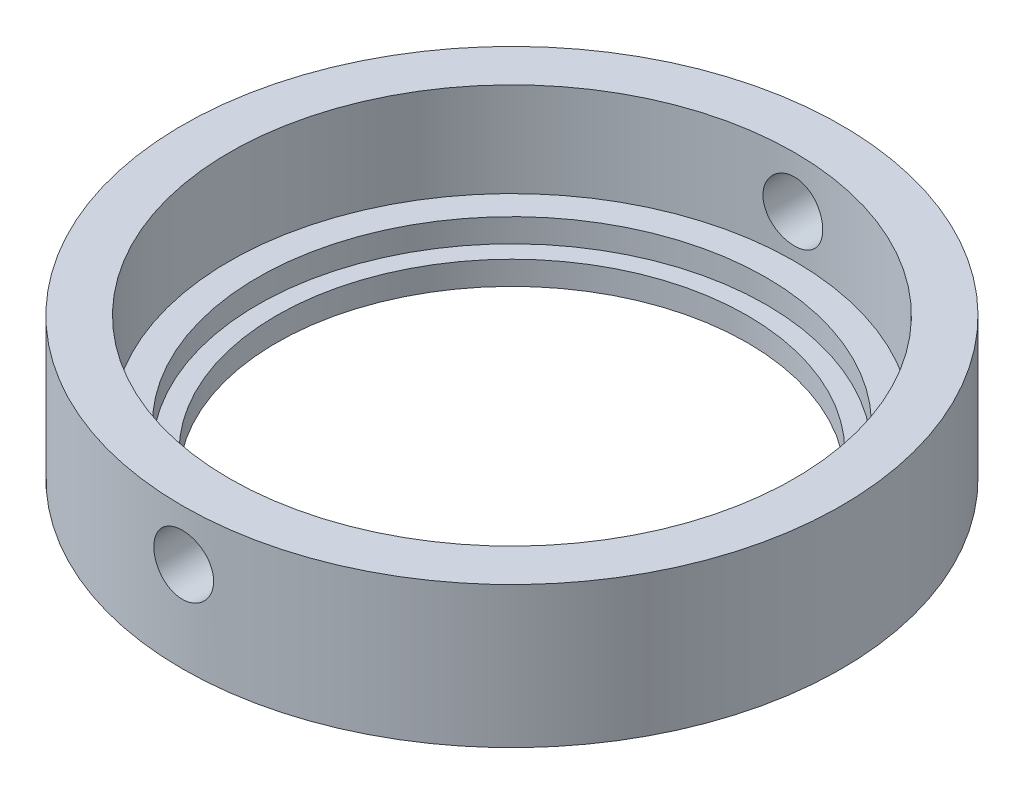
ISO-10303-21;
HEADER;
FILE_DESCRIPTION(('STEP AP214'),'2;1');
FILE_NAME('part.step','',(''),(''),'','','');
FILE_SCHEMA(('AUTOMOTIVE_DESIGN { 1 0 10303 214 1 1 1 1 }'));
ENDSEC;
DATA;
#1=APPLICATION_CONTEXT('core data for automotive mechanical design processes');
#2=APPLICATION_PROTOCOL_DEFINITION('international standard','automotive_design',2000,#1);
#3=PRODUCT_CONTEXT('',#1,'mechanical');
#4=PRODUCT('Part','Part','',(#3));
#5=PRODUCT_RELATED_PRODUCT_CATEGORY('part','',(#4));
#6=PRODUCT_DEFINITION_FORMATION('','',#4);
#7=PRODUCT_DEFINITION_CONTEXT('part definition',#1,'design');
#8=PRODUCT_DEFINITION('design','',#6,#7);
#9=PRODUCT_DEFINITION_SHAPE('','',#8);
#10=(LENGTH_UNIT() NAMED_UNIT(*) SI_UNIT(.MILLI.,.METRE.));
#11=(NAMED_UNIT(*) PLANE_ANGLE_UNIT() SI_UNIT($,.RADIAN.));
#12=(NAMED_UNIT(*) SI_UNIT($,.STERADIAN.) SOLID_ANGLE_UNIT());
#13=UNCERTAINTY_MEASURE_WITH_UNIT(LENGTH_MEASURE(1.E-05),#10,'distance_accuracy_value','');
#14=(GEOMETRIC_REPRESENTATION_CONTEXT(3) GLOBAL_UNCERTAINTY_ASSIGNED_CONTEXT((#13)) GLOBAL_UNIT_ASSIGNED_CONTEXT((#10,
#11,#12)) REPRESENTATION_CONTEXT('',''));
#15=CARTESIAN_POINT('',(0.,0.,0.));
#16=DIRECTION('',(0.,0.,1.));
#17=DIRECTION('',(1.,0.,0.));
#18=AXIS2_PLACEMENT_3D('',#15,#16,#17);
#19=CARTESIAN_POINT('',(0.,25.,0.));
#20=DIRECTION('',(0.,-1.,0.));
#21=DIRECTION('',(0.,0.,-1.));
#22=AXIS2_PLACEMENT_3D('',#19,#20,#21);
#23=CYLINDRICAL_SURFACE('',#22,35.);
#24=CARTESIAN_POINT('',(0.,12.747,-35.));
#25=CARTESIAN_POINT('',(-0.177948742697632,12.7469922545125,-34.9999981255321));
#26=CARTESIAN_POINT('',(-0.356017159290866,12.7319894593025,-34.9986284485605));
#27=CARTESIAN_POINT('',(-0.707223011450132,12.6723636020864,-34.9932962323467));
#28=CARTESIAN_POINT('',(-0.880354698570392,12.6277073710008,-34.9893307896615));
#29=CARTESIAN_POINT('',(-1.21655001135586,12.51008030149,-34.9792549516629));
#30=CARTESIAN_POINT('',(-1.37961943170621,12.4371259392296,-34.9731458046864));
#31=CARTESIAN_POINT('',(-1.69116073272575,12.2650040682958,-34.9594668246718));
#32=CARTESIAN_POINT('',(-1.83963563448663,12.1658420004081,-34.9518972949009));
#33=CARTESIAN_POINT('',(-2.11825486781866,11.9438002526063,-34.9361210135998));
#34=CARTESIAN_POINT('',(-2.24834947817906,11.8208582930058,-34.9279126233868));
#35=CARTESIAN_POINT('',(-2.48608826872777,11.5548788468456,-34.9117974222512));
#36=CARTESIAN_POINT('',(-2.59373144116536,11.4118404587239,-34.9038906248788));
#37=CARTESIAN_POINT('',(-2.78368370229865,11.109422703355,-34.8892566499268));
#38=CARTESIAN_POINT('',(-2.86594849261247,10.950015402935,-34.8825315437145));
#39=CARTESIAN_POINT('',(-3.00252588383444,10.619579058852,-34.8710419026051));
#40=CARTESIAN_POINT('',(-3.05683906092586,10.4485502548324,-34.8662773272948));
#41=CARTESIAN_POINT('',(-3.13582576722564,10.1002282230882,-34.8592624859316));
#42=CARTESIAN_POINT('',(-3.16058099809251,9.92295366417832,-34.8570052903947));
#43=CARTESIAN_POINT('',(-3.18000156835787,9.56675245101314,-34.85523906293));
#44=CARTESIAN_POINT('',(-3.17466756743406,9.38782583306353,-34.8557299707526));
#45=CARTESIAN_POINT('',(-3.13412853022921,9.03396085199345,-34.8593981713109));
#46=CARTESIAN_POINT('',(-3.099012460119,8.85901220228197,-34.8625674629733));
#47=CARTESIAN_POINT('',(-3.00004440808104,8.51750220556002,-34.8712228066297));
#48=CARTESIAN_POINT('',(-2.93619210010109,8.35094095373996,-34.8767088849107));
#49=CARTESIAN_POINT('',(-2.78146508731726,8.03065133599692,-34.8893888718863));
#50=CARTESIAN_POINT('',(-2.69055065422548,7.87694226550939,-34.8965852882732));
#51=CARTESIAN_POINT('',(-2.48430871747526,7.58693131231446,-34.9118728705317));
#52=CARTESIAN_POINT('',(-2.36898062671689,7.45062984835178,-34.9199640579186));
#53=CARTESIAN_POINT('',(-2.11668700776328,7.19878604614869,-34.9361651349145));
#54=CARTESIAN_POINT('',(-1.97964460037356,7.08332070792731,-34.9442749860746));
#55=CARTESIAN_POINT('',(-1.68808015987427,6.8770227560871,-34.959571797186));
#56=CARTESIAN_POINT('',(-1.53355811204054,6.78619016321815,-34.9667587563598));
#57=CARTESIAN_POINT('',(-1.2113692658288,6.63174018207928,-34.9794017793163));
#58=CARTESIAN_POINT('',(-1.04370072296146,6.56812641289895,-34.9848576128989));
#59=CARTESIAN_POINT('',(-0.700002269337119,6.46997481012006,-34.9934211590151));
#60=CARTESIAN_POINT('',(-0.523972564365016,6.43543626131362,-34.9965289293076));
#61=CARTESIAN_POINT('',(-0.169215792966083,6.39651254292779,-35.0000387747087));
#62=CARTESIAN_POINT('',(0.00949951840106239,6.39202105967293,-35.0004503893503));
#63=CARTESIAN_POINT('',(0.365140481966832,6.41304015925837,-34.9985470668293));
#64=CARTESIAN_POINT('',(0.542066153976297,6.43855040961989,-34.996232159882));
#65=CARTESIAN_POINT('',(0.888800869856207,6.51876068219514,-34.9891421663528));
#66=CARTESIAN_POINT('',(1.05862145445478,6.57341121574768,-34.984371251259));
#67=CARTESIAN_POINT('',(1.38668342386707,6.71030004971781,-34.9729048825346));
#68=CARTESIAN_POINT('',(1.54492459302018,6.79253886379361,-34.9662093930713));
#69=CARTESIAN_POINT('',(1.84581834398523,6.98253549147747,-34.9516199689331));
#70=CARTESIAN_POINT('',(1.98842644581429,7.09036349173276,-34.9437227599138));
#71=CARTESIAN_POINT('',(2.25355641777019,7.32837658048486,-34.9276274589351));
#72=CARTESIAN_POINT('',(2.37607787394442,7.45856212962064,-34.919429360779));
#73=CARTESIAN_POINT('',(2.59792317453891,7.73805724027525,-34.9036278187437));
#74=CARTESIAN_POINT('',(2.69717747445058,7.88742211946041,-34.8960262016566));
#75=CARTESIAN_POINT('',(2.86919363716132,8.20076168059596,-34.8823050529928));
#76=CARTESIAN_POINT('',(2.9419558060689,8.36473619370922,-34.8761855042916));
#77=CARTESIAN_POINT('',(3.05880464720211,8.70239740384427,-34.8661321652402));
#78=CARTESIAN_POINT('',(3.1029333886915,8.87606944329042,-34.8621951694497));
#79=CARTESIAN_POINT('',(3.16139949835712,9.22839533348805,-34.8569423290691));
#80=CARTESIAN_POINT('',(3.17573755679722,9.40704906871414,-34.8556264237472));
#81=CARTESIAN_POINT('',(3.17420665739822,9.76357587731869,-34.8557658194857));
#82=CARTESIAN_POINT('',(3.15844695661828,9.94144943391356,-34.8572110972571));
#83=CARTESIAN_POINT('',(3.09739625157212,10.2920117882234,-34.8626886861032));
#84=CARTESIAN_POINT('',(3.05210520683774,10.4647005788332,-34.8667210007229));
#85=CARTESIAN_POINT('',(2.93330620875594,10.799995105634,-34.8769156279369));
#86=CARTESIAN_POINT('',(2.85980076072276,10.9626017355876,-34.8830777514086));
#87=CARTESIAN_POINT('',(2.68667125180549,11.273185484489,-34.8968380429297));
#88=CARTESIAN_POINT('',(2.58704748946488,11.4211627706297,-34.9044361945643));
#89=CARTESIAN_POINT('',(2.36409852020826,11.6988469854394,-34.9202453521334));
#90=CARTESIAN_POINT('',(2.24069212754026,11.8284886156796,-34.9284583966232));
#91=CARTESIAN_POINT('',(1.97383516253548,12.0652755596085,-34.9445532724279));
#92=CARTESIAN_POINT('',(1.83037976847913,12.1724154461421,-34.9524350234731));
#93=CARTESIAN_POINT('',(1.52717127800737,12.3613295541533,-34.9669961169828));
#94=CARTESIAN_POINT('',(1.36738405595656,12.4430491580035,-34.9736728576436));
#95=CARTESIAN_POINT('',(1.03640157261243,12.578392017516,-34.985042217158));
#96=CARTESIAN_POINT('',(0.865219572025612,12.6320473103248,-34.989737097241));
#97=CARTESIAN_POINT('',(0.577537133788959,12.6961934239307,-34.995419226925));
#98=CARTESIAN_POINT('',(0.462882318395325,12.7152202701312,-34.9971291170419));
#99=CARTESIAN_POINT('',(0.232168649082416,12.7406260645485,-34.9994201132818));
#100=CARTESIAN_POINT('',(0.116109799725645,12.7470050538542,-35.0000012230718));
#101=CARTESIAN_POINT('',(0.,12.747,-35.));
#102=B_SPLINE_CURVE_WITH_KNOTS('',3,(#24,#25,#26,#27,#28,#29,#30,#31,#32,#33,#34,#35,#36,#37,
#38,#39,#40,#41,#42,#43,#44,#45,#46,#47,#48,#49,#50,#51,#52,#53,#54,#55,#56,#57,#58,#59,#60,#61,
#62,#63,#64,#65,#66,#67,#68,#69,#70,#71,#72,#73,#74,#75,#76,#77,#78,#79,#80,#81,#82,#83,#84,#85,
#86,#87,#88,#89,#90,#91,#92,#93,#94,#95,#96,#97,#98,#99,#100,#101),.UNSPECIFIED.,.T.,.F.,(4,2,2,
2,2,2,2,2,2,2,2,2,2,2,2,2,2,2,2,2,2,2,2,2,2,2,2,2,2,2,2,2,2,2,2,2,2,2,4),(0.,0.533422274666073,
1.06744222027115,1.60115170631514,2.13475047984098,2.66976615190117,3.20480583340133,
3.7407742190956,4.27673155611119,4.81120398854059,5.34566470321744,5.87853445657277,
6.41141025622195,6.94507222980037,7.47874703834623,8.01435536534802,8.54996414352853,
9.08564411561022,9.62131091036304,10.1550813813275,10.6888459371112,11.2217068794814,
11.7545777435862,12.2889274245621,12.8232881162188,13.3592261841087,13.8951580592009,
14.4303007301311,14.9654310014203,15.4986224025451,16.0318145343282,16.5649593319566,
17.0980980357781,17.6330900048623,18.1682108598915,18.7044736501385,19.2401229197564,
19.5881768242244,19.9362295979712),.UNSPECIFIED.);
#103=CARTESIAN_POINT('',(0.,12.747,-35.));
#104=VERTEX_POINT('',#103);
#105=EDGE_CURVE('E64',#104,#104,#102,.T.);
#106=ORIENTED_EDGE('',*,*,#105,.T.);
#107=EDGE_LOOP('',(#106));
#108=FACE_BOUND('',#107,.T.);
#109=CARTESIAN_POINT('',(3.175,9.572,34.8556935808198));
#110=CARTESIAN_POINT('',(3.17499225298625,9.39405295587084,34.8556954839668));
#111=CARTESIAN_POINT('',(3.1599897345043,9.21598623239612,34.8570709530369));
#112=CARTESIAN_POINT('',(3.10036507642202,8.86478389815338,34.8624238641418));
#113=CARTESIAN_POINT('',(3.05570976189453,8.6916540371603,34.8664042203977));
#114=CARTESIAN_POINT('',(2.93808537367766,8.35546258547041,34.8765124084333));
#115=CARTESIAN_POINT('',(2.86513281976534,8.19239518462475,34.8826389870582));
#116=CARTESIAN_POINT('',(2.69301520717176,7.88085726641007,34.8963477534327));
#117=CARTESIAN_POINT('',(2.59385558482639,7.73238373047528,34.9039296392075));
#118=CARTESIAN_POINT('',(2.37181630567926,7.45376295077408,34.919720384041));
#119=CARTESIAN_POINT('',(2.24887382299168,7.3236658618069,34.927930868133));
#120=CARTESIAN_POINT('',(1.98289229050827,7.08592228868483,34.9440388735663));
#121=CARTESIAN_POINT('',(1.83985234590731,6.97827680467972,34.9519363809529));
#122=CARTESIAN_POINT('',(1.53743323085979,6.78832212953939,34.9665443096334));
#123=CARTESIAN_POINT('',(1.37802639486786,6.70605681135373,34.9732526669059));
#124=CARTESIAN_POINT('',(1.04759106032629,6.56947831603079,34.9847088526285));
#125=CARTESIAN_POINT('',(0.876562798805127,6.51516456899193,34.9894567210505));
#126=CARTESIAN_POINT('',(0.52824241134786,6.43617666698811,34.996445592504));
#127=CARTESIAN_POINT('',(0.350968964567076,6.41142076213594,34.9986935086152));
#128=CARTESIAN_POINT('',(-0.00523007230355185,6.39199845859546,35.0004526620261));
#129=CARTESIAN_POINT('',(-0.184155626486546,6.39733140748658,34.9999639586642));
#130=CARTESIAN_POINT('',(-0.538025257188273,6.4378687828075,34.996310620611));
#131=CARTESIAN_POINT('',(-0.712979496513702,6.47298530196683,34.9931538608783));
#132=CARTESIAN_POINT('',(-1.05450044075038,6.57195619106736,34.9845284005082));
#133=CARTESIAN_POINT('',(-1.22106705343012,6.63581087694077,34.9790596744543));
#134=CARTESIAN_POINT('',(-1.54136315517237,6.79054280562973,34.9664117978506));
#135=CARTESIAN_POINT('',(-1.69507361877193,6.88145922065337,34.9592301708692));
#136=CARTESIAN_POINT('',(-1.98508651690573,7.08770538333184,34.943963042256));
#137=CARTESIAN_POINT('',(-2.12138853192588,7.20303571914285,34.9358775188506));
#138=CARTESIAN_POINT('',(-2.37322978425635,7.4553309258492,34.9196763524415));
#139=CARTESIAN_POINT('',(-2.48869247525424,7.59237221876483,34.9115607058394));
#140=CARTESIAN_POINT('',(-2.69498561767334,7.88393348796268,34.896243166354));
#141=CARTESIAN_POINT('',(-2.785816042904,8.03845348282908,34.8890412744422));
#142=CARTESIAN_POINT('',(-2.94026446650022,8.36064178289025,34.8763656405157));
#143=CARTESIAN_POINT('',(-3.00387817461475,8.52831215609212,34.8708921709928));
#144=CARTESIAN_POINT('',(-3.10202909393681,8.87201458668889,34.862298609853));
#145=CARTESIAN_POINT('',(-3.13656703139726,9.04804643511532,34.8591784594551));
#146=CARTESIAN_POINT('',(-3.17548844537965,9.40280418772215,34.8556546509312));
#147=CARTESIAN_POINT('',(-3.1799788110361,9.58151827314583,34.8552413637105));
#148=CARTESIAN_POINT('',(-3.15895791387345,9.93715651597856,34.8571526652915));
#149=CARTESIAN_POINT('',(-3.13344698353553,10.1140806932019,34.8594772237519));
#150=CARTESIAN_POINT('',(-3.05323690051932,10.4608080542854,34.8665935287785));
#151=CARTESIAN_POINT('',(-2.99858790737458,10.630622936216,34.8713810350229));
#152=CARTESIAN_POINT('',(-2.86170406510119,10.9586741822125,34.8828803261072));
#153=CARTESIAN_POINT('',(-2.77946869324707,11.1169103268074,34.88959214741));
#154=CARTESIAN_POINT('',(-2.58947711869073,11.4178006779816,34.9042071527232));
#155=CARTESIAN_POINT('',(-2.48164985451852,11.5604098516584,34.9121136313401));
#156=CARTESIAN_POINT('',(-2.2436376176175,11.8255423293219,34.9282161096282));
#157=CARTESIAN_POINT('',(-2.11345218942717,11.9480652240284,34.9364121151946));
#158=CARTESIAN_POINT('',(-1.833956445836,12.1699135993673,34.9521990100422));
#159=CARTESIAN_POINT('',(-1.68459079227429,12.2691695127211,34.9597880410291));
#160=CARTESIAN_POINT('',(-1.37124925537308,12.4411885069556,34.9734790184658));
#161=CARTESIAN_POINT('',(-1.20727354109164,12.5139518943409,34.9795809821201));
#162=CARTESIAN_POINT('',(-0.86961311658115,12.6308015486909,34.9896018196359));
#163=CARTESIAN_POINT('',(-0.695943247457922,12.6749304127714,34.9935239350172));
#164=CARTESIAN_POINT('',(-0.343621931785847,12.7333975031489,34.9987563838885));
#165=CARTESIAN_POINT('',(-0.164970598821014,12.7477364081347,35.0000667768799));
#166=CARTESIAN_POINT('',(0.19155768962503,12.7462079640708,34.9999281768158));
#167=CARTESIAN_POINT('',(0.369435122939479,12.7304488532393,34.9984890714753));
#168=CARTESIAN_POINT('',(0.720005377176429,12.669397963676,34.993032696508));
#169=CARTESIAN_POINT('',(0.892698192200208,12.624106151345,34.9890154239482));
#170=CARTESIAN_POINT('',(1.22800073512134,12.5053041152694,34.9788531733981));
#171=CARTESIAN_POINT('',(1.39061134625823,12.4317963674169,34.972708382098));
#172=CARTESIAN_POINT('',(1.70120209680973,12.2586610274661,34.9589774952473));
#173=CARTESIAN_POINT('',(1.84918240588149,12.1590337383065,34.9513914164132));
#174=CARTESIAN_POINT('',(2.12686640745159,11.936080905487,34.9355961871967));
#175=CARTESIAN_POINT('',(2.25650544609473,11.8126749816241,34.927384982297));
#176=CARTESIAN_POINT('',(2.49328738036604,11.5458200184147,34.9112824457696));
#177=CARTESIAN_POINT('',(2.60042484207106,11.4023661515725,34.9033911917777));
#178=CARTESIAN_POINT('',(2.78933635824016,11.0991588899395,34.8888037470057));
#179=CARTESIAN_POINT('',(2.87105535483433,10.9393710952704,34.8821101635786));
#180=CARTESIAN_POINT('',(3.00639692011166,10.6083873941823,34.8707073775001));
#181=CARTESIAN_POINT('',(3.06005153444145,10.4372047521005,34.8659959127519));
#182=CARTESIAN_POINT('',(3.12419572439496,10.1495241312245,34.8602926495327));
#183=CARTESIAN_POINT('',(3.14322170495106,10.0348719107408,34.8585760221931));
#184=CARTESIAN_POINT('',(3.16862634930384,9.80416344087777,34.8562758688196));
#185=CARTESIAN_POINT('',(3.17500505478497,9.68810719612728,34.8556923390511));
#186=CARTESIAN_POINT('',(3.175,9.572,34.8556935808198));
#187=B_SPLINE_CURVE_WITH_KNOTS('',3,(#109,#110,#111,#112,#113,#114,#115,#116,#117,#118,#119,
#120,#121,#122,#123,#124,#125,#126,#127,#128,#129,#130,#131,#132,#133,#134,#135,#136,#137,#138,
#139,#140,#141,#142,#143,#144,#145,#146,#147,#148,#149,#150,#151,#152,#153,#154,#155,#156,#157,
#158,#159,#160,#161,#162,#163,#164,#165,#166,#167,#168,#169,#170,#171,#172,#173,#174,#175,#176,
#177,#178,#179,#180,#181,#182,#183,#184,#185,#186),.UNSPECIFIED.,.T.,.F.,(4,2,2,2,2,2,2,2,2,2,2,
2,2,2,2,2,2,2,2,2,2,2,2,2,2,2,2,2,2,2,2,2,2,2,2,2,2,2,4),(0.,0.533417172754105,1.06743212919456,
1.60113579863659,2.13472884455478,2.66975119263391,3.20479736922111,3.7407633271076,
4.27671835680878,4.81118760437271,5.34564526301415,5.87853091853924,6.41142243247067,
6.94508909644297,7.47876861845118,8.01437021725027,8.54997238553158,9.08565895127641,
9.62133213627596,10.1550987371484,10.6888594227541,11.2217042220061,11.7545591185343,
12.2889112793561,12.8232743268379,13.3592152789135,13.8951500302368,14.4302856785892,
14.9654091350971,15.4986118082815,16.0318150880864,16.5649715910582,17.0981219106704,
17.6331071282273,18.1682213916034,18.7044867992556,19.240138521724,19.5881846313235,
19.936229593788),.UNSPECIFIED.);
#188=CARTESIAN_POINT('',(3.175,9.572,34.8556935808198));
#189=VERTEX_POINT('',#188);
#190=EDGE_CURVE('E86',#189,#189,#187,.T.);
#191=ORIENTED_EDGE('',*,*,#190,.T.);
#192=EDGE_LOOP('',(#191));
#193=FACE_BOUND('',#192,.T.);
#194=CARTESIAN_POINT('',(0.,0.,0.));
#195=DIRECTION('',(0.,1.,0.));
#196=DIRECTION('',(0.,0.,1.));
#197=AXIS2_PLACEMENT_3D('',#194,#195,#196);
#198=CIRCLE('',#197,35.);
#199=CARTESIAN_POINT('',(0.,0.,35.));
#200=VERTEX_POINT('',#199);
#201=EDGE_CURVE('E10',#200,#200,#198,.T.);
#202=ORIENTED_EDGE('',*,*,#201,.T.);
#203=EDGE_LOOP('',(#202));
#204=FACE_BOUND('',#203,.T.);
#205=CARTESIAN_POINT('',(0.,15.,0.));
#206=DIRECTION('',(0.,1.,0.));
#207=DIRECTION('',(0.,0.,1.));
#208=AXIS2_PLACEMENT_3D('',#205,#206,#207);
#209=CIRCLE('',#208,35.);
#210=CARTESIAN_POINT('',(0.,15.,35.));
#211=VERTEX_POINT('',#210);
#212=EDGE_CURVE('E63',#211,#211,#209,.T.);
#213=ORIENTED_EDGE('',*,*,#212,.F.);
#214=EDGE_LOOP('',(#213));
#215=FACE_BOUND('',#214,.T.);
#216=ADVANCED_FACE('F35',(#108,#193,#204,#215),#23,.T.);
#217=CARTESIAN_POINT('',(0.,5.,0.));
#218=DIRECTION('',(0.,1.,0.));
#219=DIRECTION('',(0.,0.,1.));
#220=AXIS2_PLACEMENT_3D('',#217,#218,#219);
#221=CYLINDRICAL_SURFACE('',#220,30.);
#222=CARTESIAN_POINT('',(0.,6.397,30.));
#223=CARTESIAN_POINT('',(0.177807654987433,6.39700767121956,29.9999978474698));
#224=CARTESIAN_POINT('',(0.355731493306236,6.41198679067898,29.9984024464545));
#225=CARTESIAN_POINT('',(0.706642522410257,6.471513104743,29.9921914966028));
#226=CARTESIAN_POINT('',(0.879624120649802,6.51609251190964,29.9875726575826));
#227=CARTESIAN_POINT('',(1.21551861287034,6.6335036851187,29.9758359924427));
#228=CARTESIAN_POINT('',(1.37843766537193,6.70631796806716,29.9687197130018));
#229=CARTESIAN_POINT('',(1.6897075289591,6.87809705954519,29.9527829805532));
#230=CARTESIAN_POINT('',(1.83806114386881,6.97705682151971,29.9439628565069));
#231=CARTESIAN_POINT('',(2.11661796256489,7.19874294568944,29.9255662351002));
#232=CARTESIAN_POINT('',(2.24675454070012,7.32155281890274,29.9159871521391));
#233=CARTESIAN_POINT('',(2.48461026758027,7.58727456937072,29.8971734990697));
#234=CARTESIAN_POINT('',(2.5923283579025,7.73018739519337,29.8879389452442));
#235=CARTESIAN_POINT('',(2.78252830670791,8.03247913897657,29.8708337668214));
#236=CARTESIAN_POINT('',(2.86494936684338,8.19189651393635,29.8629664475711));
#237=CARTESIAN_POINT('',(3.00182740933026,8.52240592079553,29.8495191002375));
#238=CARTESIAN_POINT('',(3.05628516071711,8.69349763148553,29.8439390092526));
#239=CARTESIAN_POINT('',(3.13549201128131,9.04181648929242,29.835721641165));
#240=CARTESIAN_POINT('',(3.16035211962612,9.21901812945929,29.8330733705915));
#241=CARTESIAN_POINT('',(3.18000122349869,9.57509691169495,29.8309854885551));
#242=CARTESIAN_POINT('',(3.17479109852623,9.75397400460702,29.8315457832475));
#243=CARTESIAN_POINT('',(3.13453904580925,10.1075590199846,29.8358016793868));
#244=CARTESIAN_POINT('',(3.09961855206813,10.2822809417399,29.8394845179735));
#245=CARTESIAN_POINT('',(3.00112608603292,10.6233702327904,29.8495506133466));
#246=CARTESIAN_POINT('',(2.93755368498022,10.7897374770215,29.8559339105437));
#247=CARTESIAN_POINT('',(2.78342870615924,11.1097771045452,29.8706963341271));
#248=CARTESIAN_POINT('',(2.69282248933952,11.2634234661454,29.8790794216983));
#249=CARTESIAN_POINT('',(2.48724036129015,11.5533750395816,29.8968935849213));
#250=CARTESIAN_POINT('',(2.37226365077456,11.6896796824218,29.9063246949406));
#251=CARTESIAN_POINT('',(2.12052718395869,11.9417841083338,29.9252291084516));
#252=CARTESIAN_POINT('',(1.9836625972144,12.0574792413946,29.9347023901567));
#253=CARTESIAN_POINT('',(1.69239881415076,12.2642685797989,29.9525798366552));
#254=CARTESIAN_POINT('',(1.5379995944098,12.3553627522816,29.9609840000205));
#255=CARTESIAN_POINT('',(1.2159751140181,12.5103610531889,29.9757795370097));
#256=CARTESIAN_POINT('',(1.04834714985176,12.5742596065859,29.982170497863));
#257=CARTESIAN_POINT('',(0.704658884174624,12.6729747691228,29.992215450226));
#258=CARTESIAN_POINT('',(0.528598865417452,12.7077923527191,29.9958695334437));
#259=CARTESIAN_POINT('',(0.173950154442709,12.7472238575593,30.0000172060772));
#260=CARTESIAN_POINT('',(-0.00462231826616188,12.7519821343476,30.0005259005246));
#261=CARTESIAN_POINT('',(-0.360022155720075,12.7315394885838,29.9983660426412));
#262=CARTESIAN_POINT('',(-0.536849546884511,12.7063390202911,29.9956975384859));
#263=CARTESIAN_POINT('',(-0.883321102615105,12.6268140307636,29.987492735123));
#264=CARTESIAN_POINT('',(-1.05298101373566,12.5725573656815,29.9819631186048));
#265=CARTESIAN_POINT('',(-1.38079172739154,12.4365300373031,29.9686561463577));
#266=CARTESIAN_POINT('',(-1.53894224264533,12.3547586875099,29.9608787345466));
#267=CARTESIAN_POINT('',(-1.83989583504628,12.1656670477478,29.9439078338638));
#268=CARTESIAN_POINT('',(-1.98263921973542,12.0582522265019,29.9347091510067));
#269=CARTESIAN_POINT('',(-2.24812169559177,11.8210579087938,29.9159438286952));
#270=CARTESIAN_POINT('',(-2.37086022294451,11.6912777822026,29.9063771788794));
#271=CARTESIAN_POINT('',(-2.59335246270055,11.4124056541751,29.8879084419924));
#272=CARTESIAN_POINT('',(-2.6930112274217,11.2632376856769,29.8790091985507));
#273=CARTESIAN_POINT('',(-2.86586159836349,10.9501975892217,29.8629269346366));
#274=CARTESIAN_POINT('',(-2.9390536037602,10.7863256830786,29.8557438882808));
#275=CARTESIAN_POINT('',(-3.0567349623604,10.4488509226108,29.8439254524017));
#276=CARTESIAN_POINT('',(-3.10128017390475,10.2752677275173,29.8392851074997));
#277=CARTESIAN_POINT('',(-3.16058443893681,9.92303373344716,29.8330623545424));
#278=CARTESIAN_POINT('',(-3.17534445882608,9.7443830990779,29.8314798472733));
#279=CARTESIAN_POINT('',(-3.17464502896849,9.38802932704773,29.8315542150884));
#280=CARTESIAN_POINT('',(-3.15933472717506,9.21032587457043,29.8331951022339));
#281=CARTESIAN_POINT('',(-3.09924264523786,8.86003113377714,29.8394972228419));
#282=CARTESIAN_POINT('',(-3.0544608374585,8.68743985025502,29.8441584591365));
#283=CARTESIAN_POINT('',(-2.93673930341851,8.35227384023615,29.8559715313496));
#284=CARTESIAN_POINT('',(-2.86380457151935,8.18969734303325,29.8631229254892));
#285=CARTESIAN_POINT('',(-2.69186267234923,7.87906909260034,29.8791113943282));
#286=CARTESIAN_POINT('',(-2.5928555488748,7.7310173149722,29.887948466196));
#287=CARTESIAN_POINT('',(-2.37102029405562,7.45287696180535,29.9063651143206));
#288=CARTESIAN_POINT('',(-2.24808094265472,7.32287730938943,29.9159480268389));
#289=CARTESIAN_POINT('',(-1.98209496388584,7.08528994446395,29.934746303153));
#290=CARTESIAN_POINT('',(-1.83904354480063,6.97770758809976,29.9439615786853));
#291=CARTESIAN_POINT('',(-1.53645253756816,6.78776784566775,29.9610133923549));
#292=CARTESIAN_POINT('',(-1.37686815159228,6.70548152552477,29.968846020343));
#293=CARTESIAN_POINT('',(-1.04616335695236,6.56898540743185,29.982208337095));
#294=CARTESIAN_POINT('',(-0.875056098628813,6.51474419708481,29.9877406010539));
#295=CARTESIAN_POINT('',(-0.585831008254252,6.4492883662374,29.9945007408128));
#296=CARTESIAN_POINT('',(-0.469557125304828,6.42970731249196,29.9965532556075));
#297=CARTESIAN_POINT('',(-0.235539154048822,6.40356061928937,29.9993035949899));
#298=CARTESIAN_POINT('',(-0.117795072737902,6.39699491792485,30.000001426021));
#299=CARTESIAN_POINT('',(0.,6.397,30.));
#300=B_SPLINE_CURVE_WITH_KNOTS('',3,(#222,#223,#224,#225,#226,#227,#228,#229,#230,#231,#232,
#233,#234,#235,#236,#237,#238,#239,#240,#241,#242,#243,#244,#245,#246,#247,#248,#249,#250,#251,
#252,#253,#254,#255,#256,#257,#258,#259,#260,#261,#262,#263,#264,#265,#266,#267,#268,#269,#270,
#271,#272,#273,#274,#275,#276,#277,#278,#279,#280,#281,#282,#283,#284,#285,#286,#287,#288,#289,
#290,#291,#292,#293,#294,#295,#296,#297,#298,#299),.UNSPECIFIED.,.T.,.F.,(4,2,2,2,2,2,2,2,2,2,2,
2,2,2,2,2,2,2,2,2,2,2,2,2,2,2,2,2,2,2,2,2,2,2,2,2,2,2,4),(0.,0.532992795540272,1.06656657410381,
1.59981048889929,2.13295155297772,2.66799420797329,3.20306211770056,3.73940610641939,
4.27573534403603,4.81004661928988,5.34434226698723,5.87646454290178,6.4085947819715,
6.94178794726598,7.47499860255335,8.01084404270631,8.54669019861446,9.08264614867197,
9.61858413898732,10.1519463943296,10.6853005624907,11.2174145635553,11.7495418419578,
12.283661880283,12.8177969695801,13.3540918746811,13.8903786909558,14.4256166060649,
14.9608371547228,15.4934097278433,16.0259828003608,16.5584614371851,17.090939179555,
17.6259532690743,18.1610950428468,18.6977267709635,19.2337561264596,19.5868580430058,
19.9399582800225),.UNSPECIFIED.);
#301=CARTESIAN_POINT('',(0.,6.397,30.));
#302=VERTEX_POINT('',#301);
#303=EDGE_CURVE('E39',#302,#302,#300,.T.);
#304=ORIENTED_EDGE('',*,*,#303,.T.);
#305=EDGE_LOOP('',(#304));
#306=FACE_BOUND('',#305,.T.);
#307=CARTESIAN_POINT('',(3.175,9.572,-29.8315164716781));
#308=CARTESIAN_POINT('',(3.17499232597746,9.39419548914317,-29.8315186693013));
#309=CARTESIAN_POINT('',(3.16001371836072,9.21627478520911,-29.8331232593283));
#310=CARTESIAN_POINT('',(3.10048962215901,8.86537026838977,-29.8393670343309));
#311=CARTESIAN_POINT('',(3.05591191008893,8.69239205051584,-29.8440095264818));
#312=CARTESIAN_POINT('',(2.93850569539611,8.35650470665585,-29.8557974882508));
#313=CARTESIAN_POINT('',(2.86569475641548,8.19358939352774,-29.8629414014894));
#314=CARTESIAN_POINT('',(2.6939235401684,7.88232579751046,-29.8789253622307));
#315=CARTESIAN_POINT('',(2.5949683012683,7.73397471544081,-29.8877650828381));
#316=CARTESIAN_POINT('',(2.37328674955711,7.45541504494343,-29.9061847921237));
#317=CARTESIAN_POINT('',(2.25047591489401,7.32527388246871,-29.915767337907));
#318=CARTESIAN_POINT('',(1.98475031556473,7.08740930537617,-29.9345698273888));
#319=CARTESIAN_POINT('',(1.84183461485274,6.97968693511567,-29.9437897541788));
#320=CARTESIAN_POINT('',(1.5395403439687,6.78948250424641,-29.960853666418));
#321=CARTESIAN_POINT('',(1.38012381123227,6.70706045773531,-29.9686943617289));
#322=CARTESIAN_POINT('',(1.04961623468536,6.57018035942947,-29.9820884798435));
#323=CARTESIAN_POINT('',(0.878525507224084,6.51572155022306,-29.9876419645977));
#324=CARTESIAN_POINT('',(0.530209692873413,6.43651249888744,-29.9958179696521));
#325=CARTESIAN_POINT('',(0.353010133219049,6.41165115180412,-29.9984514486946));
#326=CARTESIAN_POINT('',(-0.00306457295900717,6.39199884957973,-30.0005280268383));
#327=CARTESIAN_POINT('',(-0.181939671077982,6.39720702841703,-29.9999712178219));
#328=CARTESIAN_POINT('',(-0.535533252753303,6.43745599383298,-29.9957389039074));
#329=CARTESIAN_POINT('',(-0.710265506329202,6.4723773056694,-29.9920758890768));
#330=CARTESIAN_POINT('',(-1.05137503840571,6.5708749867798,-29.9820570566813));
#331=CARTESIAN_POINT('',(-1.21775219726353,6.63445176626272,-29.9757012005678));
#332=CARTESIAN_POINT('',(-1.53780386715655,6.78858582344487,-29.9609896572776));
#333=CARTESIAN_POINT('',(-1.69145285083159,6.87919572070125,-29.9526300761773));
#334=CARTESIAN_POINT('',(-1.98140810875154,7.08478571063362,-29.9348485181592));
#335=CARTESIAN_POINT('',(-2.1177138126834,7.19976660438945,-29.9254265063239));
#336=CARTESIAN_POINT('',(-2.36981353623558,7.45150604591151,-29.9065223089413));
#337=CARTESIAN_POINT('',(-2.48550374981608,7.58836856814869,-29.8970400548036));
#338=CARTESIAN_POINT('',(-2.69228414510209,7.87962646514626,-29.879130051217));
#339=CARTESIAN_POINT('',(-2.78337428371572,8.0340218706183,-29.8707023036152));
#340=CARTESIAN_POINT('',(-2.93836967985575,8.35604530220446,-29.8558549890267));
#341=CARTESIAN_POINT('',(-3.00226811935255,8.52367663460995,-29.849435925803));
#342=CARTESIAN_POINT('',(-3.10098202264007,8.86737222390356,-29.8393430678745));
#343=CARTESIAN_POINT('',(-3.13579848141903,9.04343619206612,-29.8356691792489));
#344=CARTESIAN_POINT('',(-3.17522574182296,9.39808676475912,-29.8314991228527));
#345=CARTESIAN_POINT('',(-3.17998195178533,9.57665703128451,-29.8309876579723));
#346=CARTESIAN_POINT('',(-3.1595359598065,9.93205196041981,-29.8331599744986));
#347=CARTESIAN_POINT('',(-3.13433421223534,10.1088766494637,-29.835843707444));
#348=CARTESIAN_POINT('',(-3.05480951407826,10.4553346391061,-29.8440901064713));
#349=CARTESIAN_POINT('',(-3.00055567125512,10.6249839789974,-29.8496459394553));
#350=CARTESIAN_POINT('',(-2.86453752618456,10.9527747981728,-29.8630049967098));
#351=CARTESIAN_POINT('',(-2.78277252076635,11.1109159831888,-29.8708082784231));
#352=CARTESIAN_POINT('',(-2.59369024250607,11.4118631768306,-29.8878199523747));
#353=CARTESIAN_POINT('',(-2.48627682714179,11.554608479234,-29.8970335834772));
#354=CARTESIAN_POINT('',(-2.24908419595963,11.8200954788542,-29.9158108230602));
#355=CARTESIAN_POINT('',(-2.11930435941716,11.9428366207211,-29.925374441248));
#356=CARTESIAN_POINT('',(-1.84043109872431,12.1653345695812,-29.9438204348823));
#357=CARTESIAN_POINT('',(-1.69126165426785,12.2649963699883,-29.9526998973784));
#358=CARTESIAN_POINT('',(-1.37821779075961,12.4378520662078,-29.9687344641932));
#359=CARTESIAN_POINT('',(-1.21434359410747,12.5110463622394,-29.9758895945852));
#360=CARTESIAN_POINT('',(-0.87687023137669,12.6287292228067,-29.9876562057108));
#361=CARTESIAN_POINT('',(-0.703291072937083,12.6732746382972,-29.9922727214243));
#362=CARTESIAN_POINT('',(-0.35106559707297,12.7325806788231,-29.9984626634249));
#363=CARTESIAN_POINT('',(-0.172419440561837,12.7473422486367,-30.0000361862391));
#364=CARTESIAN_POINT('',(0.183936945060471,12.7466473651229,-29.9999627143804));
#365=CARTESIAN_POINT('',(0.361647482863521,12.7313381834979,-29.9983314153365));
#366=CARTESIAN_POINT('',(0.711956675451097,12.6712458505511,-29.9920625999774));
#367=CARTESIAN_POINT('',(0.884555327606861,12.6264626840728,-29.9874250821163));
#368=CARTESIAN_POINT('',(1.21973619735958,12.5087356249779,-29.9756632070148));
#369=CARTESIAN_POINT('',(1.38232015710815,12.4357966464683,-29.968539283754));
#370=CARTESIAN_POINT('',(1.69296156232898,12.2638439418073,-29.9525975742896));
#371=CARTESIAN_POINT('',(1.84101903683047,12.1648302677641,-29.9437797914711));
#372=CARTESIAN_POINT('',(2.11915913009746,11.9429877778972,-29.9253858085291));
#373=CARTESIAN_POINT('',(2.24915401686701,11.8200492422436,-29.9158062393411));
#374=CARTESIAN_POINT('',(2.48673214744291,11.5540668600003,-29.8969965896567));
#375=CARTESIAN_POINT('',(2.59431002257465,11.4110182109229,-29.8877665933118));
#376=CARTESIAN_POINT('',(2.78424490696665,11.1084294909207,-29.8706733721864));
#377=CARTESIAN_POINT('',(2.86653005454161,10.9488441226153,-29.8628140686938));
#378=CARTESIAN_POINT('',(3.00302370886941,10.6181372506223,-29.8493985725552));
#379=CARTESIAN_POINT('',(3.05726364351657,10.4470289039543,-29.8438398032962));
#380=CARTESIAN_POINT('',(3.12271590395264,10.1578072220015,-29.8370455619901));
#381=CARTESIAN_POINT('',(3.14229535053533,10.0415380879465,-29.8349820679586));
#382=CARTESIAN_POINT('',(3.16843990889137,9.80752962896482,-29.8322167981758));
#383=CARTESIAN_POINT('',(3.17500508381648,9.68979031117494,-29.8315150158167));
#384=CARTESIAN_POINT('',(3.175,9.572,-29.8315164716781));
#385=B_SPLINE_CURVE_WITH_KNOTS('',3,(#307,#308,#309,#310,#311,#312,#313,#314,#315,#316,#317,
#318,#319,#320,#321,#322,#323,#324,#325,#326,#327,#328,#329,#330,#331,#332,#333,#334,#335,#336,
#337,#338,#339,#340,#341,#342,#343,#344,#345,#346,#347,#348,#349,#350,#351,#352,#353,#354,#355,
#356,#357,#358,#359,#360,#361,#362,#363,#364,#365,#366,#367,#368,#369,#370,#371,#372,#373,#374,
#375,#376,#377,#378,#379,#380,#381,#382,#383,#384),.UNSPECIFIED.,.T.,.F.,(4,2,2,2,2,2,2,2,2,2,2,
2,2,2,2,2,2,2,2,2,2,2,2,2,2,2,2,2,2,2,2,2,2,2,2,2,2,2,4),(0.,0.532983351018433,1.06654789536592,
1.59978104504524,2.13291150821975,2.66796652310955,3.20304645743282,3.73938600078341,
4.27571101608584,4.8100163253526,5.34430624636066,5.87645791707381,6.4086172058899,
6.94181916891572,7.47503866112215,8.01087156552035,8.54670540852952,9.08267352712934,
9.61862330778176,10.1519785791487,10.6853257612605,11.2174098415914,11.7495075227437,
12.2836319686941,12.8177712403326,13.3540716991737,13.8903640481922,14.4255888657897,
14.960796705166,15.4933898955391,16.0259833597905,16.5584839111185,17.0909833982938,
17.6259850717112,18.1611147263786,18.69775102954,19.2337846593712,19.5868723235062,
19.9399582742787),.UNSPECIFIED.);
#386=CARTESIAN_POINT('',(3.175,9.572,-29.8315164716781));
#387=VERTEX_POINT('',#386);
#388=EDGE_CURVE('E65',#387,#387,#385,.T.);
#389=ORIENTED_EDGE('',*,*,#388,.T.);
#390=EDGE_LOOP('',(#389));
#391=FACE_BOUND('',#390,.T.);
#392=CARTESIAN_POINT('',(0.,5.,0.));
#393=DIRECTION('',(0.,1.,0.));
#394=DIRECTION('',(0.,0.,1.));
#395=AXIS2_PLACEMENT_3D('',#392,#393,#394);
#396=CIRCLE('',#395,30.);
#397=CARTESIAN_POINT('',(0.,5.,30.));
#398=VERTEX_POINT('',#397);
#399=EDGE_CURVE('E48',#398,#398,#396,.T.);
#400=ORIENTED_EDGE('',*,*,#399,.F.);
#401=EDGE_LOOP('',(#400));
#402=FACE_BOUND('',#401,.T.);
#403=CARTESIAN_POINT('',(0.,15.,0.));
#404=DIRECTION('',(0.,1.,0.));
#405=DIRECTION('',(0.,0.,1.));
#406=AXIS2_PLACEMENT_3D('',#403,#404,#405);
#407=CIRCLE('',#406,30.);
#408=CARTESIAN_POINT('',(0.,15.,30.));
#409=VERTEX_POINT('',#408);
#410=EDGE_CURVE('E61',#409,#409,#407,.F.);
#411=ORIENTED_EDGE('',*,*,#410,.F.);
#412=EDGE_LOOP('',(#411));
#413=FACE_BOUND('',#412,.T.);
#414=ADVANCED_FACE('F70',(#306,#391,#402,#413),#221,.F.);
#415=CARTESIAN_POINT('',(0.,20.,0.));
#416=DIRECTION('',(0.,-1.,0.));
#417=DIRECTION('',(0.,0.,-1.));
#418=AXIS2_PLACEMENT_3D('',#415,#416,#417);
#419=CYLINDRICAL_SURFACE('',#418,25.);
#420=CARTESIAN_POINT('',(0.,0.,0.));
#421=DIRECTION('',(0.,-1.,0.));
#422=DIRECTION('',(0.,0.,-1.));
#423=AXIS2_PLACEMENT_3D('',#420,#421,#422);
#424=CIRCLE('',#423,25.);
#425=CARTESIAN_POINT('',(0.,0.,-25.));
#426=VERTEX_POINT('',#425);
#427=EDGE_CURVE('E53',#426,#426,#424,.T.);
#428=ORIENTED_EDGE('',*,*,#427,.T.);
#429=EDGE_LOOP('',(#428));
#430=FACE_BOUND('',#429,.T.);
#431=CARTESIAN_POINT('',(0.,2.5,0.));
#432=DIRECTION('',(0.,1.,0.));
#433=DIRECTION('',(0.,0.,1.));
#434=AXIS2_PLACEMENT_3D('',#431,#432,#433);
#435=CIRCLE('',#434,25.);
#436=CARTESIAN_POINT('',(0.,2.5,25.));
#437=VERTEX_POINT('',#436);
#438=EDGE_CURVE('E57',#437,#437,#435,.F.);
#439=ORIENTED_EDGE('',*,*,#438,.F.);
#440=EDGE_LOOP('',(#439));
#441=FACE_BOUND('',#440,.T.);
#442=ADVANCED_FACE('F105',(#430,#441),#419,.F.);
#443=CARTESIAN_POINT('',(0.,0.,0.));
#444=DIRECTION('',(0.,1.,0.));
#445=DIRECTION('',(0.,0.,1.));
#446=AXIS2_PLACEMENT_3D('',#443,#444,#445);
#447=PLANE('',#446);
#448=ORIENTED_EDGE('',*,*,#427,.F.);
#449=EDGE_LOOP('',(#448));
#450=FACE_BOUND('',#449,.T.);
#451=ORIENTED_EDGE('',*,*,#201,.F.);
#452=EDGE_LOOP('',(#451));
#453=FACE_BOUND('',#452,.T.);
#454=ADVANCED_FACE('F108',(#450,#453),#447,.F.);
#455=CARTESIAN_POINT('',(0.,5.,0.));
#456=DIRECTION('',(0.,1.,0.));
#457=DIRECTION('',(0.,0.,1.));
#458=AXIS2_PLACEMENT_3D('',#455,#456,#457);
#459=PLANE('',#458);
#460=CARTESIAN_POINT('',(0.,5.,0.));
#461=DIRECTION('',(0.,1.,0.));
#462=DIRECTION('',(0.,0.,1.));
#463=AXIS2_PLACEMENT_3D('',#460,#461,#462);
#464=CIRCLE('',#463,27.);
#465=CARTESIAN_POINT('',(0.,5.,27.));
#466=VERTEX_POINT('',#465);
#467=EDGE_CURVE('E98',#466,#466,#464,.T.);
#468=ORIENTED_EDGE('',*,*,#467,.F.);
#469=EDGE_LOOP('',(#468));
#470=FACE_BOUND('',#469,.T.);
#471=ORIENTED_EDGE('',*,*,#399,.T.);
#472=EDGE_LOOP('',(#471));
#473=FACE_BOUND('',#472,.T.);
#474=ADVANCED_FACE('F111',(#470,#473),#459,.T.);
#475=CARTESIAN_POINT('',(0.,2.5,0.));
#476=DIRECTION('',(0.,1.,0.));
#477=DIRECTION('',(0.,0.,1.));
#478=AXIS2_PLACEMENT_3D('',#475,#476,#477);
#479=PLANE('',#478);
#480=CARTESIAN_POINT('',(0.,2.5,0.));
#481=DIRECTION('',(0.,1.,0.));
#482=DIRECTION('',(0.,0.,1.));
#483=AXIS2_PLACEMENT_3D('',#480,#481,#482);
#484=CIRCLE('',#483,27.);
#485=CARTESIAN_POINT('',(0.,2.5,27.));
#486=VERTEX_POINT('',#485);
#487=EDGE_CURVE('E60',#486,#486,#484,.T.);
#488=ORIENTED_EDGE('',*,*,#487,.T.);
#489=EDGE_LOOP('',(#488));
#490=FACE_BOUND('',#489,.T.);
#491=ORIENTED_EDGE('',*,*,#438,.T.);
#492=EDGE_LOOP('',(#491));
#493=FACE_BOUND('',#492,.T.);
#494=ADVANCED_FACE('F116',(#490,#493),#479,.T.);
#495=CARTESIAN_POINT('',(0.,2.5,0.));
#496=DIRECTION('',(0.,1.,0.));
#497=DIRECTION('',(0.,0.,1.));
#498=AXIS2_PLACEMENT_3D('',#495,#496,#497);
#499=CYLINDRICAL_SURFACE('',#498,27.);
#500=ORIENTED_EDGE('',*,*,#487,.F.);
#501=EDGE_LOOP('',(#500));
#502=FACE_BOUND('',#501,.T.);
#503=ORIENTED_EDGE('',*,*,#467,.T.);
#504=EDGE_LOOP('',(#503));
#505=FACE_BOUND('',#504,.T.);
#506=ADVANCED_FACE('F132',(#502,#505),#499,.F.);
#507=CARTESIAN_POINT('',(0.,15.,0.));
#508=DIRECTION('',(0.,1.,0.));
#509=DIRECTION('',(0.,0.,1.));
#510=AXIS2_PLACEMENT_3D('',#507,#508,#509);
#511=PLANE('',#510);
#512=ORIENTED_EDGE('',*,*,#410,.T.);
#513=EDGE_LOOP('',(#512));
#514=FACE_BOUND('',#513,.T.);
#515=ORIENTED_EDGE('',*,*,#212,.T.);
#516=EDGE_LOOP('',(#515));
#517=FACE_BOUND('',#516,.T.);
#518=ADVANCED_FACE('F78',(#514,#517),#511,.T.);
#519=CARTESIAN_POINT('',(0.,9.572,-35.));
#520=DIRECTION('',(0.,0.,1.));
#521=DIRECTION('',(1.,0.,0.));
#522=AXIS2_PLACEMENT_3D('',#519,#520,#521);
#523=CYLINDRICAL_SURFACE('',#522,3.175);
#524=ORIENTED_EDGE('',*,*,#388,.F.);
#525=EDGE_LOOP('',(#524));
#526=FACE_BOUND('',#525,.T.);
#527=ORIENTED_EDGE('',*,*,#105,.F.);
#528=EDGE_LOOP('',(#527));
#529=FACE_BOUND('',#528,.T.);
#530=ADVANCED_FACE('F73',(#526,#529),#523,.F.);
#531=ORIENTED_EDGE('',*,*,#303,.F.);
#532=EDGE_LOOP('',(#531));
#533=FACE_BOUND('',#532,.T.);
#534=ORIENTED_EDGE('',*,*,#190,.F.);
#535=EDGE_LOOP('',(#534));
#536=FACE_BOUND('',#535,.T.);
#537=ADVANCED_FACE('F77',(#533,#536),#523,.F.);
#538=CLOSED_SHELL('',(#216,#414,#442,#454,#474,#494,#506,#518,#530,#537));
#539=MANIFOLD_SOLID_BREP('B2',#538);
#540=ADVANCED_BREP_SHAPE_REPRESENTATION('',(#18,#539),#14);
#541=SHAPE_DEFINITION_REPRESENTATION(#9,#540);
ENDSEC;
END-ISO-10303-21;
